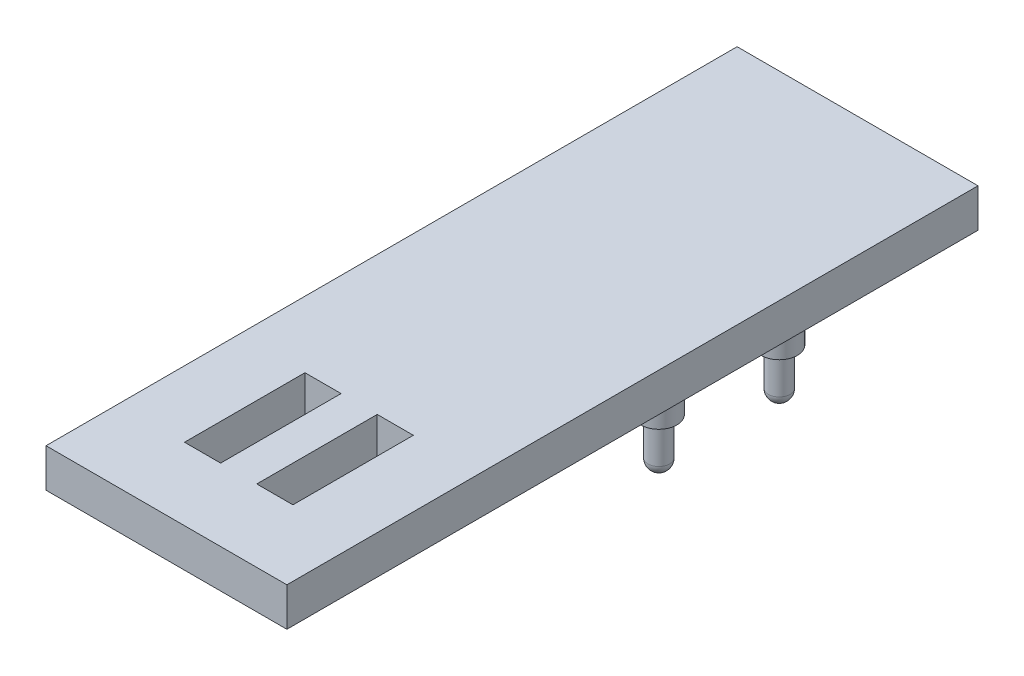
ISO-10303-21;
HEADER;
FILE_DESCRIPTION(('STEP AP214'),'2;1');
FILE_NAME('part.step','',(''),(''),'','','');
FILE_SCHEMA(('AUTOMOTIVE_DESIGN { 1 0 10303 214 1 1 1 1 }'));
ENDSEC;
DATA;
#1=APPLICATION_CONTEXT('core data for automotive mechanical design processes');
#2=APPLICATION_PROTOCOL_DEFINITION('international standard','automotive_design',2000,#1);
#3=PRODUCT_CONTEXT('',#1,'mechanical');
#4=PRODUCT('Part','Part','',(#3));
#5=PRODUCT_RELATED_PRODUCT_CATEGORY('part','',(#4));
#6=PRODUCT_DEFINITION_FORMATION('','',#4);
#7=PRODUCT_DEFINITION_CONTEXT('part definition',#1,'design');
#8=PRODUCT_DEFINITION('design','',#6,#7);
#9=PRODUCT_DEFINITION_SHAPE('','',#8);
#10=(LENGTH_UNIT() NAMED_UNIT(*) SI_UNIT(.MILLI.,.METRE.));
#11=(NAMED_UNIT(*) PLANE_ANGLE_UNIT() SI_UNIT($,.RADIAN.));
#12=(NAMED_UNIT(*) SI_UNIT($,.STERADIAN.) SOLID_ANGLE_UNIT());
#13=UNCERTAINTY_MEASURE_WITH_UNIT(LENGTH_MEASURE(1.E-05),#10,'distance_accuracy_value','');
#14=(GEOMETRIC_REPRESENTATION_CONTEXT(3) GLOBAL_UNCERTAINTY_ASSIGNED_CONTEXT((#13)) GLOBAL_UNIT_ASSIGNED_CONTEXT((#10,
#11,#12)) REPRESENTATION_CONTEXT('',''));
#15=CARTESIAN_POINT('',(0.,0.,0.));
#16=DIRECTION('',(0.,0.,1.));
#17=DIRECTION('',(1.,0.,0.));
#18=AXIS2_PLACEMENT_3D('',#15,#16,#17);
#19=CARTESIAN_POINT('',(0.,1.6,26.5767513459481));
#20=DIRECTION('',(0.,0.,-1.));
#21=DIRECTION('',(-1.,0.,0.));
#22=AXIS2_PLACEMENT_3D('',#19,#20,#21);
#23=PLANE('',#22);
#24=DIRECTION('',(1.,0.,0.));
#25=VECTOR('',#24,1.);
#26=CARTESIAN_POINT('',(0.,0.,26.5767513459481));
#27=LINE('',#26,#25);
#28=CARTESIAN_POINT('',(0.75,0.,26.5767513459481));
#29=VERTEX_POINT('',#28);
#30=CARTESIAN_POINT('',(2.25,0.,26.5767513459481));
#31=VERTEX_POINT('',#30);
#32=EDGE_CURVE('E205',#29,#31,#27,.T.);
#33=ORIENTED_EDGE('',*,*,#32,.T.);
#34=DIRECTION('',(0.,-1.,0.));
#35=VECTOR('',#34,1.);
#36=CARTESIAN_POINT('',(2.25,1.6,26.5767513459481));
#37=LINE('',#36,#35);
#38=CARTESIAN_POINT('',(2.25,1.6,26.5767513459481));
#39=VERTEX_POINT('',#38);
#40=EDGE_CURVE('E164',#39,#31,#37,.T.);
#41=ORIENTED_EDGE('',*,*,#40,.F.);
#42=DIRECTION('',(1.,0.,0.));
#43=VECTOR('',#42,1.);
#44=CARTESIAN_POINT('',(0.,1.6,26.5767513459481));
#45=LINE('',#44,#43);
#46=CARTESIAN_POINT('',(0.75,1.6,26.5767513459481));
#47=VERTEX_POINT('',#46);
#48=EDGE_CURVE('E150',#47,#39,#45,.T.);
#49=ORIENTED_EDGE('',*,*,#48,.F.);
#50=DIRECTION('',(0.,-1.,0.));
#51=VECTOR('',#50,1.);
#52=CARTESIAN_POINT('',(0.75,1.6,26.5767513459481));
#53=LINE('',#52,#51);
#54=EDGE_CURVE('E74',#47,#29,#53,.T.);
#55=ORIENTED_EDGE('',*,*,#54,.T.);
#56=EDGE_LOOP('',(#33,#41,#49,#55));
#57=FACE_BOUND('',#56,.T.);
#58=ADVANCED_FACE('F49',(#57),#23,.F.);
#59=CARTESIAN_POINT('',(2.25,1.6,0.));
#60=DIRECTION('',(1.,0.,0.));
#61=DIRECTION('',(0.,0.,-1.));
#62=AXIS2_PLACEMENT_3D('',#59,#60,#61);
#63=PLANE('',#62);
#64=DIRECTION('',(0.,0.,1.));
#65=VECTOR('',#64,1.);
#66=CARTESIAN_POINT('',(2.25,0.,0.));
#67=LINE('',#66,#65);
#68=CARTESIAN_POINT('',(2.25,0.,31.5767513459481));
#69=VERTEX_POINT('',#68);
#70=EDGE_CURVE('E159',#31,#69,#67,.T.);
#71=ORIENTED_EDGE('',*,*,#70,.T.);
#72=DIRECTION('',(0.,-1.,0.));
#73=VECTOR('',#72,1.);
#74=CARTESIAN_POINT('',(2.25,1.6,31.5767513459481));
#75=LINE('',#74,#73);
#76=CARTESIAN_POINT('',(2.25,1.6,31.5767513459481));
#77=VERTEX_POINT('',#76);
#78=EDGE_CURVE('E157',#77,#69,#75,.T.);
#79=ORIENTED_EDGE('',*,*,#78,.F.);
#80=DIRECTION('',(0.,0.,1.));
#81=VECTOR('',#80,1.);
#82=CARTESIAN_POINT('',(2.25,1.6,0.));
#83=LINE('',#82,#81);
#84=EDGE_CURVE('E144',#39,#77,#83,.T.);
#85=ORIENTED_EDGE('',*,*,#84,.F.);
#86=ORIENTED_EDGE('',*,*,#40,.T.);
#87=EDGE_LOOP('',(#71,#79,#85,#86));
#88=FACE_BOUND('',#87,.T.);
#89=ADVANCED_FACE('F158',(#88),#63,.F.);
#90=CARTESIAN_POINT('',(0.,1.6,31.5767513459481));
#91=DIRECTION('',(0.,0.,-1.));
#92=DIRECTION('',(-1.,0.,0.));
#93=AXIS2_PLACEMENT_3D('',#90,#91,#92);
#94=PLANE('',#93);
#95=DIRECTION('',(1.,0.,0.));
#96=VECTOR('',#95,1.);
#97=CARTESIAN_POINT('',(0.,0.,31.5767513459481));
#98=LINE('',#97,#96);
#99=CARTESIAN_POINT('',(0.75,0.,31.5767513459481));
#100=VERTEX_POINT('',#99);
#101=EDGE_CURVE('E210',#100,#69,#98,.T.);
#102=ORIENTED_EDGE('',*,*,#101,.F.);
#103=DIRECTION('',(0.,-1.,0.));
#104=VECTOR('',#103,1.);
#105=CARTESIAN_POINT('',(0.75,1.6,31.5767513459481));
#106=LINE('',#105,#104);
#107=CARTESIAN_POINT('',(0.75,1.6,31.5767513459481));
#108=VERTEX_POINT('',#107);
#109=EDGE_CURVE('E165',#108,#100,#106,.T.);
#110=ORIENTED_EDGE('',*,*,#109,.F.);
#111=DIRECTION('',(1.,0.,0.));
#112=VECTOR('',#111,1.);
#113=CARTESIAN_POINT('',(0.,1.6,31.5767513459481));
#114=LINE('',#113,#112);
#115=EDGE_CURVE('E149',#108,#77,#114,.T.);
#116=ORIENTED_EDGE('',*,*,#115,.T.);
#117=ORIENTED_EDGE('',*,*,#78,.T.);
#118=EDGE_LOOP('',(#102,#110,#116,#117));
#119=FACE_BOUND('',#118,.T.);
#120=ADVANCED_FACE('F167',(#119),#94,.T.);
#121=CARTESIAN_POINT('',(0.,1.6,26.5767513459481));
#122=DIRECTION('',(0.,0.,-1.));
#123=DIRECTION('',(-1.,0.,0.));
#124=AXIS2_PLACEMENT_3D('',#121,#122,#123);
#125=PLANE('',#124);
#126=DIRECTION('',(1.,0.,0.));
#127=VECTOR('',#126,1.);
#128=CARTESIAN_POINT('',(0.,0.,26.5767513459481));
#129=LINE('',#128,#127);
#130=CARTESIAN_POINT('',(-2.25,0.,26.5767513459481));
#131=VERTEX_POINT('',#130);
#132=CARTESIAN_POINT('',(-0.75,0.,26.5767513459481));
#133=VERTEX_POINT('',#132);
#134=EDGE_CURVE('E189',#131,#133,#129,.T.);
#135=ORIENTED_EDGE('',*,*,#134,.T.);
#136=DIRECTION('',(0.,-1.,0.));
#137=VECTOR('',#136,1.);
#138=CARTESIAN_POINT('',(-0.75,1.6,26.5767513459481));
#139=LINE('',#138,#137);
#140=CARTESIAN_POINT('',(-0.75,1.6,26.5767513459481));
#141=VERTEX_POINT('',#140);
#142=EDGE_CURVE('E220',#141,#133,#139,.T.);
#143=ORIENTED_EDGE('',*,*,#142,.F.);
#144=DIRECTION('',(1.,0.,0.));
#145=VECTOR('',#144,1.);
#146=CARTESIAN_POINT('',(0.,1.6,26.5767513459481));
#147=LINE('',#146,#145);
#148=CARTESIAN_POINT('',(-2.25,1.6,26.5767513459481));
#149=VERTEX_POINT('',#148);
#150=EDGE_CURVE('E299',#149,#141,#147,.T.);
#151=ORIENTED_EDGE('',*,*,#150,.F.);
#152=DIRECTION('',(0.,-1.,0.));
#153=VECTOR('',#152,1.);
#154=CARTESIAN_POINT('',(-2.25,1.6,26.5767513459481));
#155=LINE('',#154,#153);
#156=EDGE_CURVE('E226',#149,#131,#155,.T.);
#157=ORIENTED_EDGE('',*,*,#156,.T.);
#158=EDGE_LOOP('',(#135,#143,#151,#157));
#159=FACE_BOUND('',#158,.T.);
#160=ADVANCED_FACE('F371',(#159),#125,.F.);
#161=CARTESIAN_POINT('',(-0.75,1.6,0.));
#162=DIRECTION('',(1.,0.,0.));
#163=DIRECTION('',(0.,0.,-1.));
#164=AXIS2_PLACEMENT_3D('',#161,#162,#163);
#165=PLANE('',#164);
#166=DIRECTION('',(0.,0.,1.));
#167=VECTOR('',#166,1.);
#168=CARTESIAN_POINT('',(-0.75,0.,0.));
#169=LINE('',#168,#167);
#170=CARTESIAN_POINT('',(-0.75,0.,31.5767513459481));
#171=VERTEX_POINT('',#170);
#172=EDGE_CURVE('E193',#133,#171,#169,.T.);
#173=ORIENTED_EDGE('',*,*,#172,.T.);
#174=DIRECTION('',(0.,-1.,0.));
#175=VECTOR('',#174,1.);
#176=CARTESIAN_POINT('',(-0.75,1.6,31.5767513459481));
#177=LINE('',#176,#175);
#178=CARTESIAN_POINT('',(-0.75,1.6,31.5767513459481));
#179=VERTEX_POINT('',#178);
#180=EDGE_CURVE('E232',#179,#171,#177,.T.);
#181=ORIENTED_EDGE('',*,*,#180,.F.);
#182=DIRECTION('',(0.,0.,1.));
#183=VECTOR('',#182,1.);
#184=CARTESIAN_POINT('',(-0.75,1.6,0.));
#185=LINE('',#184,#183);
#186=EDGE_CURVE('E303',#141,#179,#185,.T.);
#187=ORIENTED_EDGE('',*,*,#186,.F.);
#188=ORIENTED_EDGE('',*,*,#142,.T.);
#189=EDGE_LOOP('',(#173,#181,#187,#188));
#190=FACE_BOUND('',#189,.T.);
#191=ADVANCED_FACE('F367',(#190),#165,.F.);
#192=CARTESIAN_POINT('',(0.,1.6,31.5767513459481));
#193=DIRECTION('',(0.,0.,-1.));
#194=DIRECTION('',(-1.,0.,0.));
#195=AXIS2_PLACEMENT_3D('',#192,#193,#194);
#196=PLANE('',#195);
#197=DIRECTION('',(1.,0.,0.));
#198=VECTOR('',#197,1.);
#199=CARTESIAN_POINT('',(0.,0.,31.5767513459481));
#200=LINE('',#199,#198);
#201=CARTESIAN_POINT('',(-2.25,0.,31.5767513459481));
#202=VERTEX_POINT('',#201);
#203=EDGE_CURVE('E197',#202,#171,#200,.T.);
#204=ORIENTED_EDGE('',*,*,#203,.F.);
#205=DIRECTION('',(0.,-1.,0.));
#206=VECTOR('',#205,1.);
#207=CARTESIAN_POINT('',(-2.25,1.6,31.5767513459481));
#208=LINE('',#207,#206);
#209=CARTESIAN_POINT('',(-2.25,1.6,31.5767513459481));
#210=VERTEX_POINT('',#209);
#211=EDGE_CURVE('E229',#210,#202,#208,.T.);
#212=ORIENTED_EDGE('',*,*,#211,.F.);
#213=DIRECTION('',(1.,0.,0.));
#214=VECTOR('',#213,1.);
#215=CARTESIAN_POINT('',(0.,1.6,31.5767513459481));
#216=LINE('',#215,#214);
#217=EDGE_CURVE('E306',#210,#179,#216,.T.);
#218=ORIENTED_EDGE('',*,*,#217,.T.);
#219=ORIENTED_EDGE('',*,*,#180,.T.);
#220=EDGE_LOOP('',(#204,#212,#218,#219));
#221=FACE_BOUND('',#220,.T.);
#222=ADVANCED_FACE('F354',(#221),#196,.T.);
#223=CARTESIAN_POINT('',(0.,1.6,5.88675134594813));
#224=DIRECTION('',(0.,0.,-1.));
#225=DIRECTION('',(-1.,0.,0.));
#226=AXIS2_PLACEMENT_3D('',#223,#224,#225);
#227=PLANE('',#226);
#228=DIRECTION('',(1.,0.,0.));
#229=VECTOR('',#228,1.);
#230=CARTESIAN_POINT('',(0.,0.,5.88675134594813));
#231=LINE('',#230,#229);
#232=CARTESIAN_POINT('',(-4.99999999999999,0.,5.88675134594813));
#233=VERTEX_POINT('',#232);
#234=CARTESIAN_POINT('',(4.99999999999999,0.,5.88675134594813));
#235=VERTEX_POINT('',#234);
#236=EDGE_CURVE('E176',#233,#235,#231,.T.);
#237=ORIENTED_EDGE('',*,*,#236,.F.);
#238=DIRECTION('',(0.,-1.,0.));
#239=VECTOR('',#238,1.);
#240=CARTESIAN_POINT('',(-4.99999999999999,1.6,5.88675134594813));
#241=LINE('',#240,#239);
#242=CARTESIAN_POINT('',(-4.99999999999999,1.6,5.88675134594813));
#243=VERTEX_POINT('',#242);
#244=EDGE_CURVE('E119',#243,#233,#241,.T.);
#245=ORIENTED_EDGE('',*,*,#244,.F.);
#246=DIRECTION('',(1.,0.,0.));
#247=VECTOR('',#246,1.);
#248=CARTESIAN_POINT('',(0.,1.6,5.88675134594813));
#249=LINE('',#248,#247);
#250=CARTESIAN_POINT('',(4.99999999999999,1.6,5.88675134594813));
#251=VERTEX_POINT('',#250);
#252=EDGE_CURVE('E217',#243,#251,#249,.T.);
#253=ORIENTED_EDGE('',*,*,#252,.T.);
#254=DIRECTION('',(0.,-1.,0.));
#255=VECTOR('',#254,1.);
#256=CARTESIAN_POINT('',(4.99999999999999,1.6,5.88675134594813));
#257=LINE('',#256,#255);
#258=EDGE_CURVE('E172',#251,#235,#257,.T.);
#259=ORIENTED_EDGE('',*,*,#258,.T.);
#260=EDGE_LOOP('',(#237,#245,#253,#259));
#261=FACE_BOUND('',#260,.T.);
#262=ADVANCED_FACE('F337',(#261),#227,.T.);
#263=CARTESIAN_POINT('',(-4.99999999999999,1.6,0.));
#264=DIRECTION('',(1.,0.,0.));
#265=DIRECTION('',(0.,0.,-1.));
#266=AXIS2_PLACEMENT_3D('',#263,#264,#265);
#267=PLANE('',#266);
#268=DIRECTION('',(0.,0.,1.));
#269=VECTOR('',#268,1.);
#270=CARTESIAN_POINT('',(-4.99999999999999,0.,0.));
#271=LINE('',#270,#269);
#272=CARTESIAN_POINT('',(-5.,0.,34.5767513459481));
#273=VERTEX_POINT('',#272);
#274=EDGE_CURVE('E180',#233,#273,#271,.T.);
#275=ORIENTED_EDGE('',*,*,#274,.T.);
#276=DIRECTION('',(0.,-1.,0.));
#277=VECTOR('',#276,1.);
#278=CARTESIAN_POINT('',(-5.,10.,34.5767513459481));
#279=LINE('',#278,#277);
#280=CARTESIAN_POINT('',(-5.,1.6,34.5767513459481));
#281=VERTEX_POINT('',#280);
#282=EDGE_CURVE('E65',#281,#273,#279,.T.);
#283=ORIENTED_EDGE('',*,*,#282,.F.);
#284=DIRECTION('',(0.,0.,1.));
#285=VECTOR('',#284,1.);
#286=CARTESIAN_POINT('',(-4.99999999999999,1.6,0.));
#287=LINE('',#286,#285);
#288=EDGE_CURVE('E291',#243,#281,#287,.T.);
#289=ORIENTED_EDGE('',*,*,#288,.F.);
#290=ORIENTED_EDGE('',*,*,#244,.T.);
#291=EDGE_LOOP('',(#275,#283,#289,#290));
#292=FACE_BOUND('',#291,.T.);
#293=ADVANCED_FACE('F342',(#292),#267,.F.);
#294=CARTESIAN_POINT('',(-2.25,1.6,0.));
#295=DIRECTION('',(1.,0.,0.));
#296=DIRECTION('',(0.,0.,-1.));
#297=AXIS2_PLACEMENT_3D('',#294,#295,#296);
#298=PLANE('',#297);
#299=DIRECTION('',(0.,0.,1.));
#300=VECTOR('',#299,1.);
#301=CARTESIAN_POINT('',(-2.25,0.,0.));
#302=LINE('',#301,#300);
#303=EDGE_CURVE('E201',#131,#202,#302,.T.);
#304=ORIENTED_EDGE('',*,*,#303,.F.);
#305=ORIENTED_EDGE('',*,*,#156,.F.);
#306=DIRECTION('',(0.,0.,1.));
#307=VECTOR('',#306,1.);
#308=CARTESIAN_POINT('',(-2.25,1.6,0.));
#309=LINE('',#308,#307);
#310=EDGE_CURVE('E310',#149,#210,#309,.T.);
#311=ORIENTED_EDGE('',*,*,#310,.T.);
#312=ORIENTED_EDGE('',*,*,#211,.T.);
#313=EDGE_LOOP('',(#304,#305,#311,#312));
#314=FACE_BOUND('',#313,.T.);
#315=ADVANCED_FACE('F344',(#314),#298,.T.);
#316=CARTESIAN_POINT('',(4.99999999999999,1.6,0.));
#317=DIRECTION('',(1.,0.,0.));
#318=DIRECTION('',(0.,0.,-1.));
#319=AXIS2_PLACEMENT_3D('',#316,#317,#318);
#320=PLANE('',#319);
#321=DIRECTION('',(0.,-1.,0.));
#322=VECTOR('',#321,1.);
#323=CARTESIAN_POINT('',(5.,10.,34.5767513459481));
#324=LINE('',#323,#322);
#325=CARTESIAN_POINT('',(5.,1.6,34.5767513459481));
#326=VERTEX_POINT('',#325);
#327=CARTESIAN_POINT('',(5.,0.,34.5767513459481));
#328=VERTEX_POINT('',#327);
#329=EDGE_CURVE('E316',#326,#328,#324,.T.);
#330=ORIENTED_EDGE('',*,*,#329,.T.);
#331=DIRECTION('',(0.,0.,1.));
#332=VECTOR('',#331,1.);
#333=CARTESIAN_POINT('',(4.99999999999999,0.,0.));
#334=LINE('',#333,#332);
#335=EDGE_CURVE('E185',#235,#328,#334,.T.);
#336=ORIENTED_EDGE('',*,*,#335,.F.);
#337=ORIENTED_EDGE('',*,*,#258,.F.);
#338=DIRECTION('',(0.,0.,1.));
#339=VECTOR('',#338,1.);
#340=CARTESIAN_POINT('',(4.99999999999999,1.6,0.));
#341=LINE('',#340,#339);
#342=EDGE_CURVE('E295',#251,#326,#341,.T.);
#343=ORIENTED_EDGE('',*,*,#342,.T.);
#344=EDGE_LOOP('',(#330,#336,#337,#343));
#345=FACE_BOUND('',#344,.T.);
#346=ADVANCED_FACE('F333',(#345),#320,.T.);
#347=CARTESIAN_POINT('',(0.750000000000001,1.6,0.));
#348=DIRECTION('',(1.,0.,0.));
#349=DIRECTION('',(0.,0.,-1.));
#350=AXIS2_PLACEMENT_3D('',#347,#348,#349);
#351=PLANE('',#350);
#352=DIRECTION('',(0.,0.,1.));
#353=VECTOR('',#352,1.);
#354=CARTESIAN_POINT('',(0.750000000000001,0.,0.));
#355=LINE('',#354,#353);
#356=EDGE_CURVE('E213',#29,#100,#355,.T.);
#357=ORIENTED_EDGE('',*,*,#356,.F.);
#358=ORIENTED_EDGE('',*,*,#54,.F.);
#359=DIRECTION('',(0.,0.,1.));
#360=VECTOR('',#359,1.);
#361=CARTESIAN_POINT('',(0.750000000000001,1.6,0.));
#362=LINE('',#361,#360);
#363=EDGE_CURVE('E169',#47,#108,#362,.T.);
#364=ORIENTED_EDGE('',*,*,#363,.T.);
#365=ORIENTED_EDGE('',*,*,#109,.T.);
#366=EDGE_LOOP('',(#357,#358,#364,#365));
#367=FACE_BOUND('',#366,.T.);
#368=ADVANCED_FACE('F375',(#367),#351,.T.);
#369=CARTESIAN_POINT('',(0.,1.6,0.));
#370=DIRECTION('',(0.,1.,0.));
#371=DIRECTION('',(0.,0.,1.));
#372=AXIS2_PLACEMENT_3D('',#369,#370,#371);
#373=PLANE('',#372);
#374=DIRECTION('',(-1.,0.,0.));
#375=VECTOR('',#374,1.);
#376=CARTESIAN_POINT('',(0.,1.6,34.5767513459481));
#377=LINE('',#376,#375);
#378=EDGE_CURVE('E265',#326,#281,#377,.T.);
#379=ORIENTED_EDGE('',*,*,#378,.F.);
#380=ORIENTED_EDGE('',*,*,#342,.F.);
#381=ORIENTED_EDGE('',*,*,#252,.F.);
#382=ORIENTED_EDGE('',*,*,#288,.T.);
#383=EDGE_LOOP('',(#379,#380,#381,#382));
#384=FACE_BOUND('',#383,.T.);
#385=ORIENTED_EDGE('',*,*,#150,.T.);
#386=ORIENTED_EDGE('',*,*,#186,.T.);
#387=ORIENTED_EDGE('',*,*,#217,.F.);
#388=ORIENTED_EDGE('',*,*,#310,.F.);
#389=EDGE_LOOP('',(#385,#386,#387,#388));
#390=FACE_BOUND('',#389,.T.);
#391=ORIENTED_EDGE('',*,*,#48,.T.);
#392=ORIENTED_EDGE('',*,*,#84,.T.);
#393=ORIENTED_EDGE('',*,*,#115,.F.);
#394=ORIENTED_EDGE('',*,*,#363,.F.);
#395=EDGE_LOOP('',(#391,#392,#393,#394));
#396=FACE_BOUND('',#395,.T.);
#397=ADVANCED_FACE('F146',(#384,#390,#396),#373,.T.);
#398=CARTESIAN_POINT('',(0.,0.,0.));
#399=DIRECTION('',(0.,1.,0.));
#400=DIRECTION('',(0.,0.,1.));
#401=AXIS2_PLACEMENT_3D('',#398,#399,#400);
#402=PLANE('',#401);
#403=CARTESIAN_POINT('',(0.,0.,9.13675134594813));
#404=DIRECTION('',(0.,1.,0.));
#405=DIRECTION('',(0.,0.,1.));
#406=AXIS2_PLACEMENT_3D('',#403,#404,#405);
#407=CIRCLE('',#406,1.);
#408=CARTESIAN_POINT('',(0.,0.,10.1367513459481));
#409=VERTEX_POINT('',#408);
#410=EDGE_CURVE('E245',#409,#409,#407,.F.);
#411=ORIENTED_EDGE('',*,*,#410,.F.);
#412=EDGE_LOOP('',(#411));
#413=FACE_BOUND('',#412,.T.);
#414=CARTESIAN_POINT('',(0.,0.,14.1367513459481));
#415=DIRECTION('',(0.,1.,0.));
#416=DIRECTION('',(0.,0.,1.));
#417=AXIS2_PLACEMENT_3D('',#414,#415,#416);
#418=CIRCLE('',#417,1.);
#419=CARTESIAN_POINT('',(0.,0.,15.1367513459481));
#420=VERTEX_POINT('',#419);
#421=EDGE_CURVE('E225',#420,#420,#418,.F.);
#422=ORIENTED_EDGE('',*,*,#421,.F.);
#423=EDGE_LOOP('',(#422));
#424=FACE_BOUND('',#423,.T.);
#425=ORIENTED_EDGE('',*,*,#335,.T.);
#426=DIRECTION('',(1.,0.,0.));
#427=VECTOR('',#426,1.);
#428=CARTESIAN_POINT('',(-5.,0.,34.5767513459481));
#429=LINE('',#428,#427);
#430=EDGE_CURVE('E321',#273,#328,#429,.T.);
#431=ORIENTED_EDGE('',*,*,#430,.F.);
#432=ORIENTED_EDGE('',*,*,#274,.F.);
#433=ORIENTED_EDGE('',*,*,#236,.T.);
#434=EDGE_LOOP('',(#425,#431,#432,#433));
#435=FACE_BOUND('',#434,.T.);
#436=ORIENTED_EDGE('',*,*,#134,.F.);
#437=ORIENTED_EDGE('',*,*,#303,.T.);
#438=ORIENTED_EDGE('',*,*,#203,.T.);
#439=ORIENTED_EDGE('',*,*,#172,.F.);
#440=EDGE_LOOP('',(#436,#437,#438,#439));
#441=FACE_BOUND('',#440,.T.);
#442=ORIENTED_EDGE('',*,*,#32,.F.);
#443=ORIENTED_EDGE('',*,*,#356,.T.);
#444=ORIENTED_EDGE('',*,*,#101,.T.);
#445=ORIENTED_EDGE('',*,*,#70,.F.);
#446=EDGE_LOOP('',(#442,#443,#444,#445));
#447=FACE_BOUND('',#446,.T.);
#448=ADVANCED_FACE('F335',(#413,#424,#435,#441,#447),#402,.F.);
#449=CARTESIAN_POINT('',(0.,-0.5,14.1367513459481));
#450=DIRECTION('',(0.,1.,0.));
#451=DIRECTION('',(0.,0.,1.));
#452=AXIS2_PLACEMENT_3D('',#449,#450,#451);
#453=CYLINDRICAL_SURFACE('',#452,1.);
#454=CARTESIAN_POINT('',(0.,-0.5,14.1367513459481));
#455=DIRECTION('',(0.,-1.,0.));
#456=DIRECTION('',(0.,0.,-1.));
#457=AXIS2_PLACEMENT_3D('',#454,#455,#456);
#458=CIRCLE('',#457,1.);
#459=CARTESIAN_POINT('',(0.,-0.5,13.1367513459481));
#460=VERTEX_POINT('',#459);
#461=EDGE_CURVE('E272',#460,#460,#458,.T.);
#462=ORIENTED_EDGE('',*,*,#461,.F.);
#463=EDGE_LOOP('',(#462));
#464=FACE_BOUND('',#463,.T.);
#465=ORIENTED_EDGE('',*,*,#421,.T.);
#466=EDGE_LOOP('',(#465));
#467=FACE_BOUND('',#466,.T.);
#468=ADVANCED_FACE('F443',(#464,#467),#453,.T.);
#469=CARTESIAN_POINT('',(0.,-0.5,14.1367513459481));
#470=DIRECTION('',(0.,-1.,0.));
#471=DIRECTION('',(0.,0.,-1.));
#472=AXIS2_PLACEMENT_3D('',#469,#470,#471);
#473=PLANE('',#472);
#474=CARTESIAN_POINT('',(0.,-0.5,14.1367513459481));
#475=DIRECTION('',(0.,-1.,0.));
#476=DIRECTION('',(0.,0.,-1.));
#477=AXIS2_PLACEMENT_3D('',#474,#475,#476);
#478=CIRCLE('',#477,0.75);
#479=CARTESIAN_POINT('',(0.,-0.5,13.3867513459481));
#480=VERTEX_POINT('',#479);
#481=EDGE_CURVE('E262',#480,#480,#478,.T.);
#482=ORIENTED_EDGE('',*,*,#481,.F.);
#483=EDGE_LOOP('',(#482));
#484=FACE_BOUND('',#483,.T.);
#485=ORIENTED_EDGE('',*,*,#461,.T.);
#486=EDGE_LOOP('',(#485));
#487=FACE_BOUND('',#486,.T.);
#488=ADVANCED_FACE('F452',(#484,#487),#473,.T.);
#489=CARTESIAN_POINT('',(0.,-0.5,9.13675134594813));
#490=DIRECTION('',(0.,1.,0.));
#491=DIRECTION('',(0.,0.,1.));
#492=AXIS2_PLACEMENT_3D('',#489,#490,#491);
#493=CYLINDRICAL_SURFACE('',#492,1.);
#494=CARTESIAN_POINT('',(0.,-0.5,9.13675134594813));
#495=DIRECTION('',(0.,-1.,0.));
#496=DIRECTION('',(0.,0.,-1.));
#497=AXIS2_PLACEMENT_3D('',#494,#495,#496);
#498=CIRCLE('',#497,1.);
#499=CARTESIAN_POINT('',(0.,-0.5,8.13675134594813));
#500=VERTEX_POINT('',#499);
#501=EDGE_CURVE('E181',#500,#500,#498,.T.);
#502=ORIENTED_EDGE('',*,*,#501,.F.);
#503=EDGE_LOOP('',(#502));
#504=FACE_BOUND('',#503,.T.);
#505=ORIENTED_EDGE('',*,*,#410,.T.);
#506=EDGE_LOOP('',(#505));
#507=FACE_BOUND('',#506,.T.);
#508=ADVANCED_FACE('F463',(#504,#507),#493,.T.);
#509=CARTESIAN_POINT('',(0.,-0.5,9.13675134594813));
#510=DIRECTION('',(0.,-1.,0.));
#511=DIRECTION('',(0.,0.,-1.));
#512=AXIS2_PLACEMENT_3D('',#509,#510,#511);
#513=PLANE('',#512);
#514=CARTESIAN_POINT('',(0.,-0.5,9.13675134594813));
#515=DIRECTION('',(0.,-1.,0.));
#516=DIRECTION('',(0.,0.,-1.));
#517=AXIS2_PLACEMENT_3D('',#514,#515,#516);
#518=CIRCLE('',#517,0.75);
#519=CARTESIAN_POINT('',(0.,-0.5,8.38675134594813));
#520=VERTEX_POINT('',#519);
#521=EDGE_CURVE('E248',#520,#520,#518,.T.);
#522=ORIENTED_EDGE('',*,*,#521,.F.);
#523=EDGE_LOOP('',(#522));
#524=FACE_BOUND('',#523,.T.);
#525=ORIENTED_EDGE('',*,*,#501,.T.);
#526=EDGE_LOOP('',(#525));
#527=FACE_BOUND('',#526,.T.);
#528=ADVANCED_FACE('F473',(#524,#527),#513,.T.);
#529=CARTESIAN_POINT('',(0.,-5.,9.13675134594813));
#530=DIRECTION('',(0.,1.,0.));
#531=DIRECTION('',(0.,0.,1.));
#532=AXIS2_PLACEMENT_3D('',#529,#530,#531);
#533=CYLINDRICAL_SURFACE('',#532,0.75);
#534=CARTESIAN_POINT('',(0.,-5.,9.13675134594813));
#535=DIRECTION('',(0.,-1.,0.));
#536=DIRECTION('',(0.,0.,-1.));
#537=AXIS2_PLACEMENT_3D('',#534,#535,#536);
#538=CIRCLE('',#537,0.75);
#539=CARTESIAN_POINT('',(0.,-5.,8.38675134594813));
#540=VERTEX_POINT('',#539);
#541=EDGE_CURVE('E268',#540,#540,#538,.T.);
#542=ORIENTED_EDGE('',*,*,#541,.F.);
#543=EDGE_LOOP('',(#542));
#544=FACE_BOUND('',#543,.T.);
#545=ORIENTED_EDGE('',*,*,#521,.T.);
#546=EDGE_LOOP('',(#545));
#547=FACE_BOUND('',#546,.T.);
#548=ADVANCED_FACE('F482',(#544,#547),#533,.T.);
#549=CARTESIAN_POINT('',(0.,-5.,9.13675134594813));
#550=DIRECTION('',(0.,-1.,0.));
#551=DIRECTION('',(0.,0.,-1.));
#552=AXIS2_PLACEMENT_3D('',#549,#550,#551);
#553=PLANE('',#552);
#554=CARTESIAN_POINT('',(0.,-5.,9.13675134594813));
#555=DIRECTION('',(0.,-1.,0.));
#556=DIRECTION('',(0.,0.,-1.));
#557=AXIS2_PLACEMENT_3D('',#554,#555,#556);
#558=CIRCLE('',#557,0.45);
#559=CARTESIAN_POINT('',(0.,-5.,8.68675134594813));
#560=VERTEX_POINT('',#559);
#561=EDGE_CURVE('E251',#560,#560,#558,.T.);
#562=ORIENTED_EDGE('',*,*,#561,.F.);
#563=EDGE_LOOP('',(#562));
#564=FACE_BOUND('',#563,.T.);
#565=ORIENTED_EDGE('',*,*,#541,.T.);
#566=EDGE_LOOP('',(#565));
#567=FACE_BOUND('',#566,.T.);
#568=ADVANCED_FACE('F492',(#564,#567),#553,.T.);
#569=CARTESIAN_POINT('',(0.,-5.,14.1367513459481));
#570=DIRECTION('',(0.,1.,0.));
#571=DIRECTION('',(0.,0.,1.));
#572=AXIS2_PLACEMENT_3D('',#569,#570,#571);
#573=CYLINDRICAL_SURFACE('',#572,0.75);
#574=CARTESIAN_POINT('',(0.,-5.,14.1367513459481));
#575=DIRECTION('',(0.,-1.,0.));
#576=DIRECTION('',(0.,0.,-1.));
#577=AXIS2_PLACEMENT_3D('',#574,#575,#576);
#578=CIRCLE('',#577,0.75);
#579=CARTESIAN_POINT('',(0.,-5.,13.3867513459481));
#580=VERTEX_POINT('',#579);
#581=EDGE_CURVE('E273',#580,#580,#578,.T.);
#582=ORIENTED_EDGE('',*,*,#581,.F.);
#583=EDGE_LOOP('',(#582));
#584=FACE_BOUND('',#583,.T.);
#585=ORIENTED_EDGE('',*,*,#481,.T.);
#586=EDGE_LOOP('',(#585));
#587=FACE_BOUND('',#586,.T.);
#588=ADVANCED_FACE('F503',(#584,#587),#573,.T.);
#589=CARTESIAN_POINT('',(0.,-5.,14.1367513459481));
#590=DIRECTION('',(0.,-1.,0.));
#591=DIRECTION('',(0.,0.,-1.));
#592=AXIS2_PLACEMENT_3D('',#589,#590,#591);
#593=PLANE('',#592);
#594=CARTESIAN_POINT('',(0.,-5.,14.1367513459481));
#595=DIRECTION('',(0.,-1.,0.));
#596=DIRECTION('',(0.,0.,-1.));
#597=AXIS2_PLACEMENT_3D('',#594,#595,#596);
#598=CIRCLE('',#597,0.45);
#599=CARTESIAN_POINT('',(0.,-5.,13.6867513459481));
#600=VERTEX_POINT('',#599);
#601=EDGE_CURVE('E256',#600,#600,#598,.T.);
#602=ORIENTED_EDGE('',*,*,#601,.F.);
#603=EDGE_LOOP('',(#602));
#604=FACE_BOUND('',#603,.T.);
#605=ORIENTED_EDGE('',*,*,#581,.T.);
#606=EDGE_LOOP('',(#605));
#607=FACE_BOUND('',#606,.T.);
#608=ADVANCED_FACE('F513',(#604,#607),#593,.T.);
#609=CARTESIAN_POINT('',(0.,-7.,14.1367513459481));
#610=DIRECTION('',(0.,1.,0.));
#611=DIRECTION('',(0.,0.,1.));
#612=AXIS2_PLACEMENT_3D('',#609,#610,#611);
#613=CYLINDRICAL_SURFACE('',#612,0.45);
#614=CARTESIAN_POINT('',(0.,-6.55,14.1367513459481));
#615=DIRECTION('',(0.,1.,0.));
#616=DIRECTION('',(0.,0.,1.));
#617=AXIS2_PLACEMENT_3D('',#614,#615,#616);
#618=CIRCLE('',#617,0.45);
#619=CARTESIAN_POINT('',(0.,-6.55,14.5867513459481));
#620=VERTEX_POINT('',#619);
#621=EDGE_CURVE('E58',#620,#620,#618,.T.);
#622=ORIENTED_EDGE('',*,*,#621,.T.);
#623=EDGE_LOOP('',(#622));
#624=FACE_BOUND('',#623,.T.);
#625=ORIENTED_EDGE('',*,*,#601,.T.);
#626=EDGE_LOOP('',(#625));
#627=FACE_BOUND('',#626,.T.);
#628=ADVANCED_FACE('F522',(#624,#627),#613,.T.);
#629=CARTESIAN_POINT('',(0.,-7.,9.13675134594813));
#630=DIRECTION('',(0.,1.,0.));
#631=DIRECTION('',(0.,0.,1.));
#632=AXIS2_PLACEMENT_3D('',#629,#630,#631);
#633=CYLINDRICAL_SURFACE('',#632,0.45);
#634=CARTESIAN_POINT('',(0.,-6.55,9.13675134594813));
#635=DIRECTION('',(0.,1.,0.));
#636=DIRECTION('',(0.,0.,1.));
#637=AXIS2_PLACEMENT_3D('',#634,#635,#636);
#638=CIRCLE('',#637,0.45);
#639=CARTESIAN_POINT('',(0.,-6.55,9.58675134594813));
#640=VERTEX_POINT('',#639);
#641=EDGE_CURVE('E11',#640,#640,#638,.T.);
#642=ORIENTED_EDGE('',*,*,#641,.T.);
#643=EDGE_LOOP('',(#642));
#644=FACE_BOUND('',#643,.T.);
#645=ORIENTED_EDGE('',*,*,#561,.T.);
#646=EDGE_LOOP('',(#645));
#647=FACE_BOUND('',#646,.T.);
#648=ADVANCED_FACE('F532',(#644,#647),#633,.T.);
#649=CARTESIAN_POINT('',(0.,-6.55,14.1367513459481));
#650=DIRECTION('',(0.,-1.,0.));
#651=DIRECTION('',(0.,0.,-1.));
#652=AXIS2_PLACEMENT_3D('',#649,#650,#651);
#653=SPHERICAL_SURFACE('',#652,0.45);
#654=ORIENTED_EDGE('',*,*,#621,.F.);
#655=EDGE_LOOP('',(#654));
#656=FACE_BOUND('',#655,.T.);
#657=ADVANCED_FACE('F541',(#656),#653,.T.);
#658=CARTESIAN_POINT('',(0.,-6.55,9.13675134594813));
#659=DIRECTION('',(0.,-1.,0.));
#660=DIRECTION('',(0.,0.,-1.));
#661=AXIS2_PLACEMENT_3D('',#658,#659,#660);
#662=SPHERICAL_SURFACE('',#661,0.45);
#663=ORIENTED_EDGE('',*,*,#641,.F.);
#664=EDGE_LOOP('',(#663));
#665=FACE_BOUND('',#664,.T.);
#666=ADVANCED_FACE('F51',(#665),#662,.T.);
#667=CARTESIAN_POINT('',(-5.,10.,34.5767513459481));
#668=DIRECTION('',(0.,0.,-1.));
#669=DIRECTION('',(-1.,0.,0.));
#670=AXIS2_PLACEMENT_3D('',#667,#668,#669);
#671=PLANE('',#670);
#672=ORIENTED_EDGE('',*,*,#378,.T.);
#673=ORIENTED_EDGE('',*,*,#282,.T.);
#674=ORIENTED_EDGE('',*,*,#430,.T.);
#675=ORIENTED_EDGE('',*,*,#329,.F.);
#676=EDGE_LOOP('',(#672,#673,#674,#675));
#677=FACE_BOUND('',#676,.T.);
#678=ADVANCED_FACE('F325',(#677),#671,.F.);
#679=CLOSED_SHELL('',(#58,#89,#120,#160,#191,#222,#262,#293,#315,#346,#368,#397,#448,#468,#488,
#508,#528,#548,#568,#588,#608,#628,#648,#657,#666,#678));
#680=MANIFOLD_SOLID_BREP('B2',#679);
#681=ADVANCED_BREP_SHAPE_REPRESENTATION('',(#18,#680),#14);
#682=SHAPE_DEFINITION_REPRESENTATION(#9,#681);
ENDSEC;
END-ISO-10303-21;
